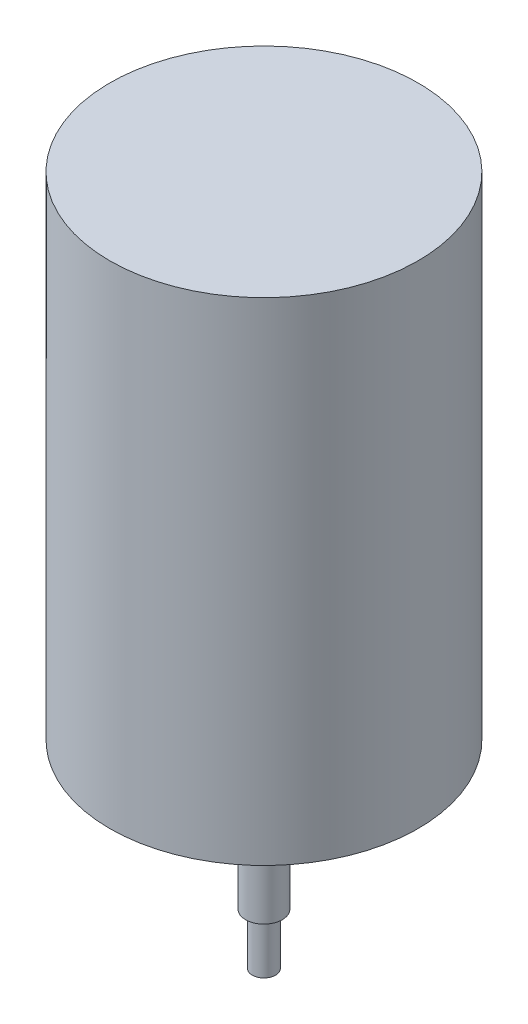
ISO-10303-21;
HEADER;
FILE_DESCRIPTION(('STEP AP214'),'2;1');
FILE_NAME('part.step','',(''),(''),'','','');
FILE_SCHEMA(('AUTOMOTIVE_DESIGN { 1 0 10303 214 1 1 1 1 }'));
ENDSEC;
DATA;
#1=APPLICATION_CONTEXT('core data for automotive mechanical design processes');
#2=APPLICATION_PROTOCOL_DEFINITION('international standard','automotive_design',2000,#1);
#3=PRODUCT_CONTEXT('',#1,'mechanical');
#4=PRODUCT('Part','Part','',(#3));
#5=PRODUCT_RELATED_PRODUCT_CATEGORY('part','',(#4));
#6=PRODUCT_DEFINITION_FORMATION('','',#4);
#7=PRODUCT_DEFINITION_CONTEXT('part definition',#1,'design');
#8=PRODUCT_DEFINITION('design','',#6,#7);
#9=PRODUCT_DEFINITION_SHAPE('','',#8);
#10=(LENGTH_UNIT() NAMED_UNIT(*) SI_UNIT(.MILLI.,.METRE.));
#11=(NAMED_UNIT(*) PLANE_ANGLE_UNIT() SI_UNIT($,.RADIAN.));
#12=(NAMED_UNIT(*) SI_UNIT($,.STERADIAN.) SOLID_ANGLE_UNIT());
#13=UNCERTAINTY_MEASURE_WITH_UNIT(LENGTH_MEASURE(1.E-05),#10,'distance_accuracy_value','');
#14=(GEOMETRIC_REPRESENTATION_CONTEXT(3) GLOBAL_UNCERTAINTY_ASSIGNED_CONTEXT((#13)) GLOBAL_UNIT_ASSIGNED_CONTEXT((#10,
#11,#12)) REPRESENTATION_CONTEXT('',''));
#15=CARTESIAN_POINT('',(0.,0.,0.));
#16=DIRECTION('',(0.,0.,1.));
#17=DIRECTION('',(1.,0.,0.));
#18=AXIS2_PLACEMENT_3D('',#15,#16,#17);
#19=CARTESIAN_POINT('',(0.,-20.,0.));
#20=DIRECTION('',(0.,-1.,0.));
#21=DIRECTION('',(0.,0.,-1.));
#22=AXIS2_PLACEMENT_3D('',#19,#20,#21);
#23=PLANE('',#22);
#24=CARTESIAN_POINT('',(0.,-20.,0.));
#25=DIRECTION('',(0.,-1.,0.));
#26=DIRECTION('',(0.,0.,-1.));
#27=AXIS2_PLACEMENT_3D('',#24,#25,#26);
#28=CIRCLE('',#27,2.5);
#29=CARTESIAN_POINT('',(0.,-20.,-2.5));
#30=VERTEX_POINT('',#29);
#31=EDGE_CURVE('E48',#30,#30,#28,.T.);
#32=ORIENTED_EDGE('',*,*,#31,.T.);
#33=EDGE_LOOP('',(#32));
#34=FACE_BOUND('',#33,.T.);
#35=CARTESIAN_POINT('',(0.,-20.,0.));
#36=DIRECTION('',(0.,-1.,0.));
#37=DIRECTION('',(0.,0.,-1.));
#38=AXIS2_PLACEMENT_3D('',#35,#36,#37);
#39=CIRCLE('',#38,1.5875);
#40=CARTESIAN_POINT('',(0.,-20.,-1.5875));
#41=VERTEX_POINT('',#40);
#42=EDGE_CURVE('E53',#41,#41,#39,.T.);
#43=ORIENTED_EDGE('',*,*,#42,.F.);
#44=EDGE_LOOP('',(#43));
#45=FACE_BOUND('',#44,.T.);
#46=ADVANCED_FACE('F32',(#34,#45),#23,.T.);
#47=CARTESIAN_POINT('',(0.,0.,0.));
#48=DIRECTION('',(0.,1.,0.));
#49=DIRECTION('',(0.,0.,1.));
#50=AXIS2_PLACEMENT_3D('',#47,#48,#49);
#51=PLANE('',#50);
#52=CARTESIAN_POINT('',(0.,0.,0.));
#53=DIRECTION('',(0.,1.,0.));
#54=DIRECTION('',(0.,0.,1.));
#55=AXIS2_PLACEMENT_3D('',#52,#53,#54);
#56=CIRCLE('',#55,21.);
#57=CARTESIAN_POINT('',(0.,0.,21.));
#58=VERTEX_POINT('',#57);
#59=EDGE_CURVE('E43',#58,#58,#56,.T.);
#60=ORIENTED_EDGE('',*,*,#59,.F.);
#61=EDGE_LOOP('',(#60));
#62=FACE_BOUND('',#61,.T.);
#63=CARTESIAN_POINT('',(0.,0.,0.));
#64=DIRECTION('',(0.,1.,0.));
#65=DIRECTION('',(0.,0.,1.));
#66=AXIS2_PLACEMENT_3D('',#63,#64,#65);
#67=CIRCLE('',#66,2.5);
#68=CARTESIAN_POINT('',(0.,0.,2.5));
#69=VERTEX_POINT('',#68);
#70=EDGE_CURVE('E10',#69,#69,#67,.F.);
#71=ORIENTED_EDGE('',*,*,#70,.F.);
#72=EDGE_LOOP('',(#71));
#73=FACE_BOUND('',#72,.T.);
#74=ADVANCED_FACE('F69',(#62,#73),#51,.F.);
#75=CARTESIAN_POINT('',(0.,67.,0.));
#76=DIRECTION('',(0.,-1.,0.));
#77=DIRECTION('',(0.,0.,-1.));
#78=AXIS2_PLACEMENT_3D('',#75,#76,#77);
#79=CYLINDRICAL_SURFACE('',#78,21.);
#80=CARTESIAN_POINT('',(0.,67.,0.));
#81=DIRECTION('',(0.,1.,0.));
#82=DIRECTION('',(0.,0.,1.));
#83=AXIS2_PLACEMENT_3D('',#80,#81,#82);
#84=CIRCLE('',#83,21.);
#85=CARTESIAN_POINT('',(0.,67.,21.));
#86=VERTEX_POINT('',#85);
#87=EDGE_CURVE('E39',#86,#86,#84,.T.);
#88=ORIENTED_EDGE('',*,*,#87,.F.);
#89=EDGE_LOOP('',(#88));
#90=FACE_BOUND('',#89,.T.);
#91=ORIENTED_EDGE('',*,*,#59,.T.);
#92=EDGE_LOOP('',(#91));
#93=FACE_BOUND('',#92,.T.);
#94=ADVANCED_FACE('F34',(#90,#93),#79,.T.);
#95=CARTESIAN_POINT('',(0.,67.,0.));
#96=DIRECTION('',(0.,1.,0.));
#97=DIRECTION('',(0.,0.,1.));
#98=AXIS2_PLACEMENT_3D('',#95,#96,#97);
#99=PLANE('',#98);
#100=ORIENTED_EDGE('',*,*,#87,.T.);
#101=EDGE_LOOP('',(#100));
#102=FACE_BOUND('',#101,.T.);
#103=ADVANCED_FACE('F80',(#102),#99,.T.);
#104=CARTESIAN_POINT('',(0.,-20.,0.));
#105=DIRECTION('',(0.,1.,0.));
#106=DIRECTION('',(0.,0.,1.));
#107=AXIS2_PLACEMENT_3D('',#104,#105,#106);
#108=CYLINDRICAL_SURFACE('',#107,2.5);
#109=ORIENTED_EDGE('',*,*,#31,.F.);
#110=EDGE_LOOP('',(#109));
#111=FACE_BOUND('',#110,.T.);
#112=ORIENTED_EDGE('',*,*,#70,.T.);
#113=EDGE_LOOP('',(#112));
#114=FACE_BOUND('',#113,.T.);
#115=ADVANCED_FACE('F64',(#111,#114),#108,.T.);
#116=CARTESIAN_POINT('',(0.,-27.,0.));
#117=DIRECTION('',(0.,1.,0.));
#118=DIRECTION('',(0.,0.,1.));
#119=AXIS2_PLACEMENT_3D('',#116,#117,#118);
#120=CYLINDRICAL_SURFACE('',#119,1.5875);
#121=CARTESIAN_POINT('',(0.,-27.,0.));
#122=DIRECTION('',(0.,-1.,0.));
#123=DIRECTION('',(0.,0.,-1.));
#124=AXIS2_PLACEMENT_3D('',#121,#122,#123);
#125=CIRCLE('',#124,1.5875);
#126=CARTESIAN_POINT('',(0.,-27.,-1.5875));
#127=VERTEX_POINT('',#126);
#128=EDGE_CURVE('E52',#127,#127,#125,.T.);
#129=ORIENTED_EDGE('',*,*,#128,.F.);
#130=EDGE_LOOP('',(#129));
#131=FACE_BOUND('',#130,.T.);
#132=ORIENTED_EDGE('',*,*,#42,.T.);
#133=EDGE_LOOP('',(#132));
#134=FACE_BOUND('',#133,.T.);
#135=ADVANCED_FACE('F61',(#131,#134),#120,.T.);
#136=CARTESIAN_POINT('',(0.,-27.,0.));
#137=DIRECTION('',(0.,-1.,0.));
#138=DIRECTION('',(0.,0.,-1.));
#139=AXIS2_PLACEMENT_3D('',#136,#137,#138);
#140=PLANE('',#139);
#141=ORIENTED_EDGE('',*,*,#128,.T.);
#142=EDGE_LOOP('',(#141));
#143=FACE_BOUND('',#142,.T.);
#144=ADVANCED_FACE('F59',(#143),#140,.T.);
#145=CLOSED_SHELL('',(#46,#74,#94,#103,#115,#135,#144));
#146=MANIFOLD_SOLID_BREP('B2',#145);
#147=ADVANCED_BREP_SHAPE_REPRESENTATION('',(#18,#146),#14);
#148=SHAPE_DEFINITION_REPRESENTATION(#9,#147);
ENDSEC;
END-ISO-10303-21;
